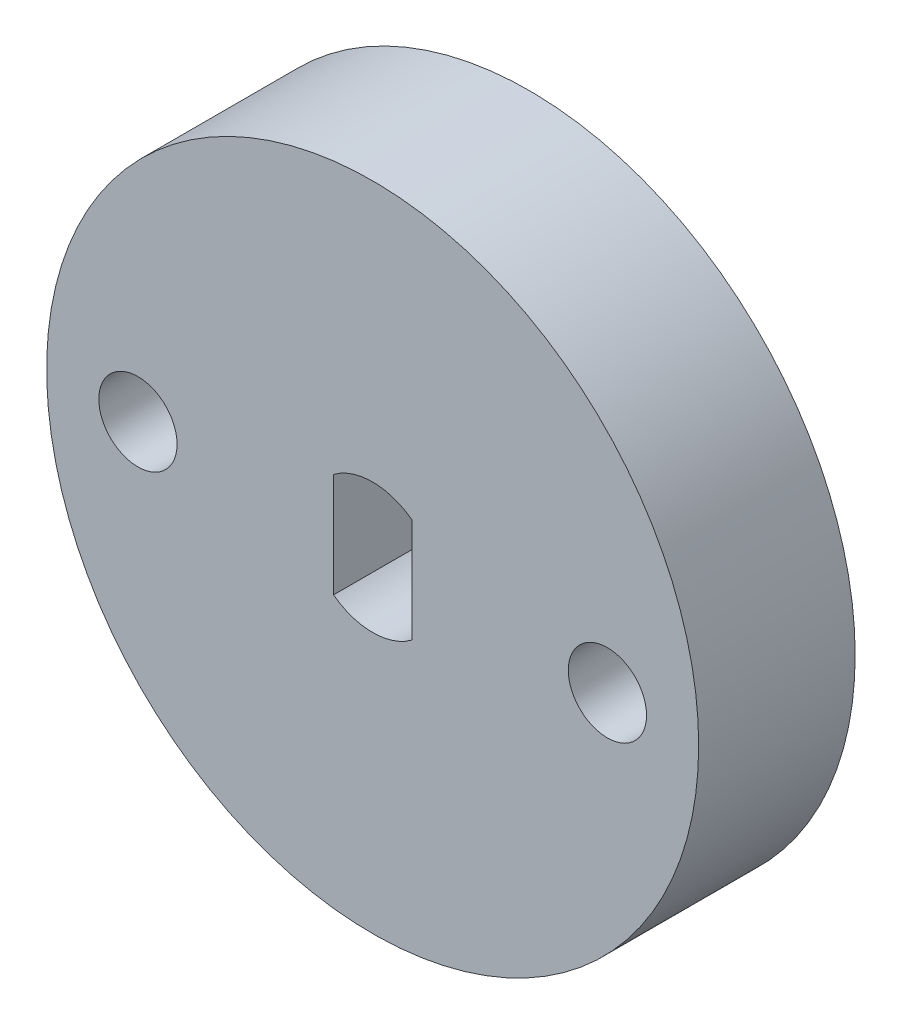
ISO-10303-21;
HEADER;
FILE_DESCRIPTION(('STEP AP214'),'2;1');
FILE_NAME('part.step','',(''),(''),'','','');
FILE_SCHEMA(('AUTOMOTIVE_DESIGN { 1 0 10303 214 1 1 1 1 }'));
ENDSEC;
DATA;
#1=APPLICATION_CONTEXT('core data for automotive mechanical design processes');
#2=APPLICATION_PROTOCOL_DEFINITION('international standard','automotive_design',2000,#1);
#3=PRODUCT_CONTEXT('',#1,'mechanical');
#4=PRODUCT('Part','Part','',(#3));
#5=PRODUCT_RELATED_PRODUCT_CATEGORY('part','',(#4));
#6=PRODUCT_DEFINITION_FORMATION('','',#4);
#7=PRODUCT_DEFINITION_CONTEXT('part definition',#1,'design');
#8=PRODUCT_DEFINITION('design','',#6,#7);
#9=PRODUCT_DEFINITION_SHAPE('','',#8);
#10=(LENGTH_UNIT() NAMED_UNIT(*) SI_UNIT(.MILLI.,.METRE.));
#11=(NAMED_UNIT(*) PLANE_ANGLE_UNIT() SI_UNIT($,.RADIAN.));
#12=(NAMED_UNIT(*) SI_UNIT($,.STERADIAN.) SOLID_ANGLE_UNIT());
#13=UNCERTAINTY_MEASURE_WITH_UNIT(LENGTH_MEASURE(1.E-05),#10,'distance_accuracy_value','');
#14=(GEOMETRIC_REPRESENTATION_CONTEXT(3) GLOBAL_UNCERTAINTY_ASSIGNED_CONTEXT((#13)) GLOBAL_UNIT_ASSIGNED_CONTEXT((#10,
#11,#12)) REPRESENTATION_CONTEXT('',''));
#15=CARTESIAN_POINT('',(0.,0.,0.));
#16=DIRECTION('',(0.,0.,1.));
#17=DIRECTION('',(1.,0.,0.));
#18=AXIS2_PLACEMENT_3D('',#15,#16,#17);
#19=CARTESIAN_POINT('',(0.,0.,3.));
#20=DIRECTION('',(0.,0.,-1.));
#21=DIRECTION('',(-1.,0.,0.));
#22=AXIS2_PLACEMENT_3D('',#19,#20,#21);
#23=CYLINDRICAL_SURFACE('',#22,12.5);
#24=CARTESIAN_POINT('',(0.,0.,3.));
#25=DIRECTION('',(0.,0.,1.));
#26=DIRECTION('',(1.,0.,0.));
#27=AXIS2_PLACEMENT_3D('',#24,#25,#26);
#28=CIRCLE('',#27,12.5);
#29=CARTESIAN_POINT('',(12.5,0.,3.));
#30=VERTEX_POINT('',#29);
#31=EDGE_CURVE('E11',#30,#30,#28,.T.);
#32=ORIENTED_EDGE('',*,*,#31,.F.);
#33=EDGE_LOOP('',(#32));
#34=FACE_BOUND('',#33,.T.);
#35=CARTESIAN_POINT('',(0.,0.,-3.));
#36=DIRECTION('',(0.,0.,1.));
#37=DIRECTION('',(1.,0.,0.));
#38=AXIS2_PLACEMENT_3D('',#35,#36,#37);
#39=CIRCLE('',#38,12.5);
#40=CARTESIAN_POINT('',(12.5,0.,-3.));
#41=VERTEX_POINT('',#40);
#42=EDGE_CURVE('E42',#41,#41,#39,.T.);
#43=ORIENTED_EDGE('',*,*,#42,.T.);
#44=EDGE_LOOP('',(#43));
#45=FACE_BOUND('',#44,.T.);
#46=ADVANCED_FACE('F39',(#34,#45),#23,.T.);
#47=CARTESIAN_POINT('',(0.,0.,3.));
#48=DIRECTION('',(0.,0.,1.));
#49=DIRECTION('',(1.,0.,0.));
#50=AXIS2_PLACEMENT_3D('',#47,#48,#49);
#51=PLANE('',#50);
#52=CARTESIAN_POINT('',(-9.,0.,3.));
#53=DIRECTION('',(0.,0.,1.));
#54=DIRECTION('',(1.,0.,0.));
#55=AXIS2_PLACEMENT_3D('',#52,#53,#54);
#56=CIRCLE('',#55,1.5);
#57=CARTESIAN_POINT('',(-7.5,0.,3.));
#58=VERTEX_POINT('',#57);
#59=EDGE_CURVE('E162',#58,#58,#56,.T.);
#60=ORIENTED_EDGE('',*,*,#59,.F.);
#61=EDGE_LOOP('',(#60));
#62=FACE_BOUND('',#61,.T.);
#63=CARTESIAN_POINT('',(9.,0.,3.));
#64=DIRECTION('',(0.,0.,1.));
#65=DIRECTION('',(1.,0.,0.));
#66=AXIS2_PLACEMENT_3D('',#63,#64,#65);
#67=CIRCLE('',#66,1.5);
#68=CARTESIAN_POINT('',(10.5,0.,3.));
#69=VERTEX_POINT('',#68);
#70=EDGE_CURVE('E108',#69,#69,#67,.T.);
#71=ORIENTED_EDGE('',*,*,#70,.F.);
#72=EDGE_LOOP('',(#71));
#73=FACE_BOUND('',#72,.T.);
#74=CARTESIAN_POINT('',(0.,0.,3.));
#75=DIRECTION('',(0.,0.,1.));
#76=DIRECTION('',(1.,0.,0.));
#77=AXIS2_PLACEMENT_3D('',#74,#75,#76);
#78=CIRCLE('',#77,2.5);
#79=CARTESIAN_POINT('',(1.5,2.,3.));
#80=VERTEX_POINT('',#79);
#81=CARTESIAN_POINT('',(-1.5,2.,3.));
#82=VERTEX_POINT('',#81);
#83=EDGE_CURVE('E54',#80,#82,#78,.T.);
#84=ORIENTED_EDGE('',*,*,#83,.F.);
#85=DIRECTION('',(0.,1.,0.));
#86=VECTOR('',#85,1.);
#87=CARTESIAN_POINT('',(1.5,-2.,3.));
#88=LINE('',#87,#86);
#89=CARTESIAN_POINT('',(1.5,-2.,3.));
#90=VERTEX_POINT('',#89);
#91=EDGE_CURVE('E101',#90,#80,#88,.T.);
#92=ORIENTED_EDGE('',*,*,#91,.F.);
#93=CARTESIAN_POINT('',(0.,0.,3.));
#94=DIRECTION('',(0.,0.,1.));
#95=DIRECTION('',(1.,0.,0.));
#96=AXIS2_PLACEMENT_3D('',#93,#94,#95);
#97=CIRCLE('',#96,2.5);
#98=CARTESIAN_POINT('',(-1.5,-2.,3.));
#99=VERTEX_POINT('',#98);
#100=EDGE_CURVE('E105',#99,#90,#97,.T.);
#101=ORIENTED_EDGE('',*,*,#100,.F.);
#102=DIRECTION('',(0.,-1.,0.));
#103=VECTOR('',#102,1.);
#104=CARTESIAN_POINT('',(-1.5,-2.,3.));
#105=LINE('',#104,#103);
#106=EDGE_CURVE('E117',#82,#99,#105,.T.);
#107=ORIENTED_EDGE('',*,*,#106,.F.);
#108=EDGE_LOOP('',(#84,#92,#101,#107));
#109=FACE_BOUND('',#108,.T.);
#110=ORIENTED_EDGE('',*,*,#31,.T.);
#111=EDGE_LOOP('',(#110));
#112=FACE_BOUND('',#111,.T.);
#113=ADVANCED_FACE('F134',(#62,#73,#109,#112),#51,.T.);
#114=CARTESIAN_POINT('',(0.,0.,-3.));
#115=DIRECTION('',(0.,0.,1.));
#116=DIRECTION('',(1.,0.,0.));
#117=AXIS2_PLACEMENT_3D('',#114,#115,#116);
#118=PLANE('',#117);
#119=CARTESIAN_POINT('',(-9.,0.,-3.));
#120=DIRECTION('',(0.,0.,1.));
#121=DIRECTION('',(1.,0.,0.));
#122=AXIS2_PLACEMENT_3D('',#119,#120,#121);
#123=CIRCLE('',#122,1.5);
#124=CARTESIAN_POINT('',(-7.5,0.,-3.));
#125=VERTEX_POINT('',#124);
#126=EDGE_CURVE('E159',#125,#125,#123,.T.);
#127=ORIENTED_EDGE('',*,*,#126,.T.);
#128=EDGE_LOOP('',(#127));
#129=FACE_BOUND('',#128,.T.);
#130=CARTESIAN_POINT('',(9.,0.,-3.));
#131=DIRECTION('',(0.,0.,1.));
#132=DIRECTION('',(1.,0.,0.));
#133=AXIS2_PLACEMENT_3D('',#130,#131,#132);
#134=CIRCLE('',#133,1.5);
#135=CARTESIAN_POINT('',(10.5,0.,-3.));
#136=VERTEX_POINT('',#135);
#137=EDGE_CURVE('E168',#136,#136,#134,.T.);
#138=ORIENTED_EDGE('',*,*,#137,.T.);
#139=EDGE_LOOP('',(#138));
#140=FACE_BOUND('',#139,.T.);
#141=DIRECTION('',(0.,1.,0.));
#142=VECTOR('',#141,1.);
#143=CARTESIAN_POINT('',(1.5,-2.,-3.));
#144=LINE('',#143,#142);
#145=CARTESIAN_POINT('',(1.5,-2.,-3.));
#146=VERTEX_POINT('',#145);
#147=CARTESIAN_POINT('',(1.5,2.,-3.));
#148=VERTEX_POINT('',#147);
#149=EDGE_CURVE('E89',#146,#148,#144,.T.);
#150=ORIENTED_EDGE('',*,*,#149,.T.);
#151=CARTESIAN_POINT('',(0.,0.,-3.));
#152=DIRECTION('',(0.,0.,1.));
#153=DIRECTION('',(1.,0.,0.));
#154=AXIS2_PLACEMENT_3D('',#151,#152,#153);
#155=CIRCLE('',#154,2.5);
#156=CARTESIAN_POINT('',(-1.5,2.,-3.));
#157=VERTEX_POINT('',#156);
#158=EDGE_CURVE('E82',#148,#157,#155,.T.);
#159=ORIENTED_EDGE('',*,*,#158,.T.);
#160=DIRECTION('',(0.,-1.,0.));
#161=VECTOR('',#160,1.);
#162=CARTESIAN_POINT('',(-1.5,-2.,-3.));
#163=LINE('',#162,#161);
#164=CARTESIAN_POINT('',(-1.5,-2.,-3.));
#165=VERTEX_POINT('',#164);
#166=EDGE_CURVE('E92',#157,#165,#163,.T.);
#167=ORIENTED_EDGE('',*,*,#166,.T.);
#168=CARTESIAN_POINT('',(0.,0.,-3.));
#169=DIRECTION('',(0.,0.,1.));
#170=DIRECTION('',(1.,0.,0.));
#171=AXIS2_PLACEMENT_3D('',#168,#169,#170);
#172=CIRCLE('',#171,2.5);
#173=EDGE_CURVE('E62',#165,#146,#172,.T.);
#174=ORIENTED_EDGE('',*,*,#173,.T.);
#175=EDGE_LOOP('',(#150,#159,#167,#174));
#176=FACE_BOUND('',#175,.T.);
#177=ORIENTED_EDGE('',*,*,#42,.F.);
#178=EDGE_LOOP('',(#177));
#179=FACE_BOUND('',#178,.T.);
#180=ADVANCED_FACE('F97',(#129,#140,#176,#179),#118,.F.);
#181=CARTESIAN_POINT('',(0.,0.,-3.));
#182=DIRECTION('',(0.,0.,1.));
#183=DIRECTION('',(1.,0.,0.));
#184=AXIS2_PLACEMENT_3D('',#181,#182,#183);
#185=CYLINDRICAL_SURFACE('',#184,2.5);
#186=ORIENTED_EDGE('',*,*,#83,.T.);
#187=DIRECTION('',(0.,0.,1.));
#188=VECTOR('',#187,1.);
#189=CARTESIAN_POINT('',(-1.5,2.,-3.));
#190=LINE('',#189,#188);
#191=EDGE_CURVE('E78',#157,#82,#190,.T.);
#192=ORIENTED_EDGE('',*,*,#191,.F.);
#193=ORIENTED_EDGE('',*,*,#158,.F.);
#194=DIRECTION('',(0.,0.,1.));
#195=VECTOR('',#194,1.);
#196=CARTESIAN_POINT('',(1.5,2.,-3.));
#197=LINE('',#196,#195);
#198=EDGE_CURVE('E123',#148,#80,#197,.T.);
#199=ORIENTED_EDGE('',*,*,#198,.T.);
#200=EDGE_LOOP('',(#186,#192,#193,#199));
#201=FACE_BOUND('',#200,.T.);
#202=ADVANCED_FACE('F80',(#201),#185,.F.);
#203=CARTESIAN_POINT('',(1.5,-2.,-3.));
#204=DIRECTION('',(1.,0.,0.));
#205=DIRECTION('',(0.,0.,-1.));
#206=AXIS2_PLACEMENT_3D('',#203,#204,#205);
#207=PLANE('',#206);
#208=ORIENTED_EDGE('',*,*,#91,.T.);
#209=ORIENTED_EDGE('',*,*,#198,.F.);
#210=ORIENTED_EDGE('',*,*,#149,.F.);
#211=DIRECTION('',(0.,0.,1.));
#212=VECTOR('',#211,1.);
#213=CARTESIAN_POINT('',(1.5,-2.,-3.));
#214=LINE('',#213,#212);
#215=EDGE_CURVE('E126',#146,#90,#214,.T.);
#216=ORIENTED_EDGE('',*,*,#215,.T.);
#217=EDGE_LOOP('',(#208,#209,#210,#216));
#218=FACE_BOUND('',#217,.T.);
#219=ADVANCED_FACE('F137',(#218),#207,.F.);
#220=CARTESIAN_POINT('',(0.,0.,-3.));
#221=DIRECTION('',(0.,0.,1.));
#222=DIRECTION('',(1.,0.,0.));
#223=AXIS2_PLACEMENT_3D('',#220,#221,#222);
#224=CYLINDRICAL_SURFACE('',#223,2.5);
#225=ORIENTED_EDGE('',*,*,#100,.T.);
#226=ORIENTED_EDGE('',*,*,#215,.F.);
#227=ORIENTED_EDGE('',*,*,#173,.F.);
#228=DIRECTION('',(0.,0.,1.));
#229=VECTOR('',#228,1.);
#230=CARTESIAN_POINT('',(-1.5,-2.,-3.));
#231=LINE('',#230,#229);
#232=EDGE_CURVE('E88',#165,#99,#231,.T.);
#233=ORIENTED_EDGE('',*,*,#232,.T.);
#234=EDGE_LOOP('',(#225,#226,#227,#233));
#235=FACE_BOUND('',#234,.T.);
#236=ADVANCED_FACE('F130',(#235),#224,.F.);
#237=CARTESIAN_POINT('',(-1.5,-2.,-3.));
#238=DIRECTION('',(-1.,0.,0.));
#239=DIRECTION('',(0.,0.,1.));
#240=AXIS2_PLACEMENT_3D('',#237,#238,#239);
#241=PLANE('',#240);
#242=ORIENTED_EDGE('',*,*,#106,.T.);
#243=ORIENTED_EDGE('',*,*,#232,.F.);
#244=ORIENTED_EDGE('',*,*,#166,.F.);
#245=ORIENTED_EDGE('',*,*,#191,.T.);
#246=EDGE_LOOP('',(#242,#243,#244,#245));
#247=FACE_BOUND('',#246,.T.);
#248=ADVANCED_FACE('F93',(#247),#241,.F.);
#249=CARTESIAN_POINT('',(9.,0.,-3.));
#250=DIRECTION('',(0.,0.,1.));
#251=DIRECTION('',(1.,0.,0.));
#252=AXIS2_PLACEMENT_3D('',#249,#250,#251);
#253=CYLINDRICAL_SURFACE('',#252,1.5);
#254=ORIENTED_EDGE('',*,*,#137,.F.);
#255=EDGE_LOOP('',(#254));
#256=FACE_BOUND('',#255,.T.);
#257=ORIENTED_EDGE('',*,*,#70,.T.);
#258=EDGE_LOOP('',(#257));
#259=FACE_BOUND('',#258,.T.);
#260=ADVANCED_FACE('F178',(#256,#259),#253,.F.);
#261=CARTESIAN_POINT('',(-9.,0.,-3.));
#262=DIRECTION('',(0.,0.,1.));
#263=DIRECTION('',(1.,0.,0.));
#264=AXIS2_PLACEMENT_3D('',#261,#262,#263);
#265=CYLINDRICAL_SURFACE('',#264,1.5);
#266=ORIENTED_EDGE('',*,*,#126,.F.);
#267=EDGE_LOOP('',(#266));
#268=FACE_BOUND('',#267,.T.);
#269=ORIENTED_EDGE('',*,*,#59,.T.);
#270=EDGE_LOOP('',(#269));
#271=FACE_BOUND('',#270,.T.);
#272=ADVANCED_FACE('F181',(#268,#271),#265,.F.);
#273=CLOSED_SHELL('',(#46,#113,#180,#202,#219,#236,#248,#260,#272));
#274=MANIFOLD_SOLID_BREP('B2',#273);
#275=ADVANCED_BREP_SHAPE_REPRESENTATION('',(#18,#274),#14);
#276=SHAPE_DEFINITION_REPRESENTATION(#9,#275);
ENDSEC;
END-ISO-10303-21;
